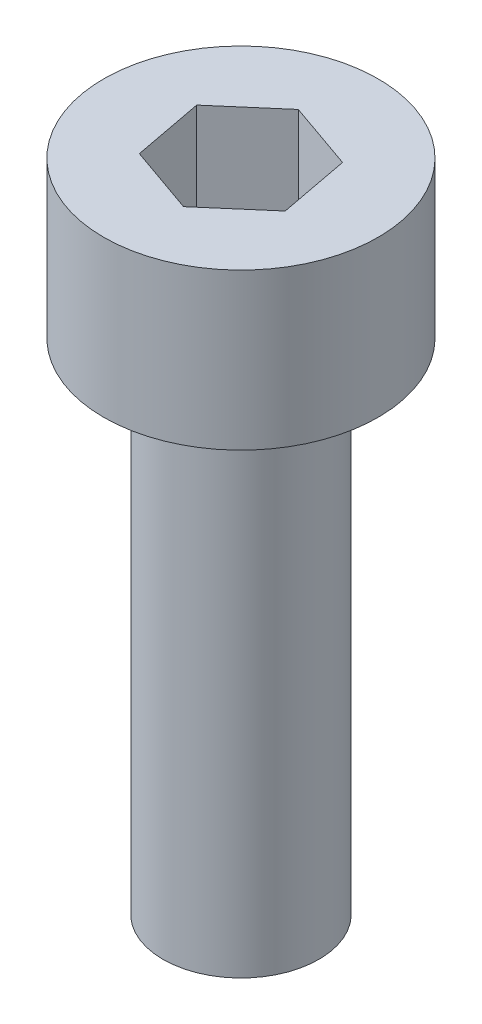
ISO-10303-21;
HEADER;
FILE_DESCRIPTION(('STEP AP214'),'2;1');
FILE_NAME('part.step','',(''),(''),'','','');
FILE_SCHEMA(('AUTOMOTIVE_DESIGN { 1 0 10303 214 1 1 1 1 }'));
ENDSEC;
DATA;
#1=APPLICATION_CONTEXT('core data for automotive mechanical design processes');
#2=APPLICATION_PROTOCOL_DEFINITION('international standard','automotive_design',2000,#1);
#3=PRODUCT_CONTEXT('',#1,'mechanical');
#4=PRODUCT('Part','Part','',(#3));
#5=PRODUCT_RELATED_PRODUCT_CATEGORY('part','',(#4));
#6=PRODUCT_DEFINITION_FORMATION('','',#4);
#7=PRODUCT_DEFINITION_CONTEXT('part definition',#1,'design');
#8=PRODUCT_DEFINITION('design','',#6,#7);
#9=PRODUCT_DEFINITION_SHAPE('','',#8);
#10=(LENGTH_UNIT() NAMED_UNIT(*) SI_UNIT(.MILLI.,.METRE.));
#11=(NAMED_UNIT(*) PLANE_ANGLE_UNIT() SI_UNIT($,.RADIAN.));
#12=(NAMED_UNIT(*) SI_UNIT($,.STERADIAN.) SOLID_ANGLE_UNIT());
#13=UNCERTAINTY_MEASURE_WITH_UNIT(LENGTH_MEASURE(1.E-05),#10,'distance_accuracy_value','');
#14=(GEOMETRIC_REPRESENTATION_CONTEXT(3) GLOBAL_UNCERTAINTY_ASSIGNED_CONTEXT((#13)) GLOBAL_UNIT_ASSIGNED_CONTEXT((#10,
#11,#12)) REPRESENTATION_CONTEXT('',''));
#15=CARTESIAN_POINT('',(0.,0.,0.));
#16=DIRECTION('',(0.,0.,1.));
#17=DIRECTION('',(1.,0.,0.));
#18=AXIS2_PLACEMENT_3D('',#15,#16,#17);
#19=CARTESIAN_POINT('',(0.,0.,0.));
#20=DIRECTION('',(0.,-1.,0.));
#21=DIRECTION('',(0.,0.,-1.));
#22=AXIS2_PLACEMENT_3D('',#19,#20,#21);
#23=PLANE('',#22);
#24=CARTESIAN_POINT('',(0.,0.,0.));
#25=DIRECTION('',(0.,1.,0.));
#26=DIRECTION('',(0.,0.,1.));
#27=AXIS2_PLACEMENT_3D('',#24,#25,#26);
#28=CIRCLE('',#27,1.25);
#29=CARTESIAN_POINT('',(0.,0.,1.25));
#30=VERTEX_POINT('',#29);
#31=EDGE_CURVE('E11',#30,#30,#28,.T.);
#32=ORIENTED_EDGE('',*,*,#31,.F.);
#33=EDGE_LOOP('',(#32));
#34=FACE_BOUND('',#33,.T.);
#35=ADVANCED_FACE('F37',(#34),#23,.T.);
#36=CARTESIAN_POINT('',(0.,8.82222536057694,0.));
#37=DIRECTION('',(0.,1.,0.));
#38=DIRECTION('',(0.,0.,1.));
#39=AXIS2_PLACEMENT_3D('',#36,#37,#38);
#40=CYLINDRICAL_SURFACE('',#39,1.25);
#41=ORIENTED_EDGE('',*,*,#31,.T.);
#42=EDGE_LOOP('',(#41));
#43=FACE_BOUND('',#42,.T.);
#44=CARTESIAN_POINT('',(0.,8.,0.));
#45=DIRECTION('',(0.,1.,0.));
#46=DIRECTION('',(0.,0.,1.));
#47=AXIS2_PLACEMENT_3D('',#44,#45,#46);
#48=CIRCLE('',#47,1.25);
#49=CARTESIAN_POINT('',(0.,8.,1.25));
#50=VERTEX_POINT('',#49);
#51=EDGE_CURVE('E44',#50,#50,#48,.T.);
#52=ORIENTED_EDGE('',*,*,#51,.F.);
#53=EDGE_LOOP('',(#52));
#54=FACE_BOUND('',#53,.T.);
#55=ADVANCED_FACE('F154',(#43,#54),#40,.T.);
#56=CARTESIAN_POINT('',(-1.25,8.,0.));
#57=DIRECTION('',(0.,-1.,0.));
#58=DIRECTION('',(0.,0.,-1.));
#59=AXIS2_PLACEMENT_3D('',#56,#57,#58);
#60=PLANE('',#59);
#61=ORIENTED_EDGE('',*,*,#51,.T.);
#62=EDGE_LOOP('',(#61));
#63=FACE_BOUND('',#62,.T.);
#64=CARTESIAN_POINT('',(0.,8.,0.));
#65=DIRECTION('',(0.,1.,0.));
#66=DIRECTION('',(0.,0.,1.));
#67=AXIS2_PLACEMENT_3D('',#64,#65,#66);
#68=CIRCLE('',#67,2.2);
#69=CARTESIAN_POINT('',(0.,8.,2.2));
#70=VERTEX_POINT('',#69);
#71=EDGE_CURVE('E146',#70,#70,#68,.T.);
#72=ORIENTED_EDGE('',*,*,#71,.F.);
#73=EDGE_LOOP('',(#72));
#74=FACE_BOUND('',#73,.T.);
#75=ADVANCED_FACE('F151',(#63,#74),#60,.T.);
#76=CARTESIAN_POINT('',(0.,8.82222536057694,0.));
#77=DIRECTION('',(0.,1.,0.));
#78=DIRECTION('',(0.,0.,1.));
#79=AXIS2_PLACEMENT_3D('',#76,#77,#78);
#80=CYLINDRICAL_SURFACE('',#79,2.2);
#81=ORIENTED_EDGE('',*,*,#71,.T.);
#82=EDGE_LOOP('',(#81));
#83=FACE_BOUND('',#82,.T.);
#84=CARTESIAN_POINT('',(0.,10.5,0.));
#85=DIRECTION('',(0.,1.,0.));
#86=DIRECTION('',(0.,0.,1.));
#87=AXIS2_PLACEMENT_3D('',#84,#85,#86);
#88=CIRCLE('',#87,2.2);
#89=CARTESIAN_POINT('',(0.,10.5,2.2));
#90=VERTEX_POINT('',#89);
#91=EDGE_CURVE('E138',#90,#90,#88,.T.);
#92=ORIENTED_EDGE('',*,*,#91,.F.);
#93=EDGE_LOOP('',(#92));
#94=FACE_BOUND('',#93,.T.);
#95=ADVANCED_FACE('F161',(#83,#94),#80,.T.);
#96=CARTESIAN_POINT('',(-2.2,10.5,0.));
#97=DIRECTION('',(0.,1.,0.));
#98=DIRECTION('',(0.,0.,1.));
#99=AXIS2_PLACEMENT_3D('',#96,#97,#98);
#100=PLANE('',#99);
#101=DIRECTION('',(-0.186175824705709,0.,-0.982516443778499));
#102=VECTOR('',#101,1.);
#103=CARTESIAN_POINT('',(1.09000510628894,10.5,0.381080308593042));
#104=LINE('',#103,#102);
#105=CARTESIAN_POINT('',(1.09000510628894,10.5,0.381080308593042));
#106=VERTEX_POINT('',#105);
#107=CARTESIAN_POINT('',(0.875027781268058,10.5,-0.753431958004459));
#108=VERTEX_POINT('',#107);
#109=EDGE_CURVE('E51',#106,#108,#104,.T.);
#110=ORIENTED_EDGE('',*,*,#109,.F.);
#111=DIRECTION('',(0.757796287595271,0.,-0.652491215654912));
#112=VECTOR('',#111,1.);
#113=CARTESIAN_POINT('',(0.214977325020883,10.5,1.1345122665975));
#114=LINE('',#113,#112);
#115=CARTESIAN_POINT('',(0.214977325020883,10.5,1.1345122665975));
#116=VERTEX_POINT('',#115);
#117=EDGE_CURVE('E134',#116,#106,#114,.T.);
#118=ORIENTED_EDGE('',*,*,#117,.F.);
#119=DIRECTION('',(0.94397211230098,0.,0.330025228123587));
#120=VECTOR('',#119,1.);
#121=CARTESIAN_POINT('',(-0.875027781268057,10.5,0.75343195800446));
#122=LINE('',#121,#120);
#123=CARTESIAN_POINT('',(-0.875027781268057,10.5,0.75343195800446));
#124=VERTEX_POINT('',#123);
#125=EDGE_CURVE('E132',#124,#116,#122,.T.);
#126=ORIENTED_EDGE('',*,*,#125,.F.);
#127=DIRECTION('',(0.186175824705709,0.,0.982516443778499));
#128=VECTOR('',#127,1.);
#129=CARTESIAN_POINT('',(-1.09000510628894,10.5,-0.381080308593041));
#130=LINE('',#129,#128);
#131=CARTESIAN_POINT('',(-1.09000510628894,10.5,-0.381080308593041));
#132=VERTEX_POINT('',#131);
#133=EDGE_CURVE('E99',#132,#124,#130,.T.);
#134=ORIENTED_EDGE('',*,*,#133,.F.);
#135=DIRECTION('',(-0.757796287595271,0.,0.652491215654912));
#136=VECTOR('',#135,1.);
#137=CARTESIAN_POINT('',(-0.214977325020883,10.5,-1.1345122665975));
#138=LINE('',#137,#136);
#139=CARTESIAN_POINT('',(-0.214977325020883,10.5,-1.1345122665975));
#140=VERTEX_POINT('',#139);
#141=EDGE_CURVE('E128',#140,#132,#138,.T.);
#142=ORIENTED_EDGE('',*,*,#141,.F.);
#143=DIRECTION('',(-0.94397211230098,0.,-0.330025228123587));
#144=VECTOR('',#143,1.);
#145=CARTESIAN_POINT('',(0.875027781268058,10.5,-0.753431958004459));
#146=LINE('',#145,#144);
#147=EDGE_CURVE('E125',#108,#140,#146,.T.);
#148=ORIENTED_EDGE('',*,*,#147,.F.);
#149=EDGE_LOOP('',(#110,#118,#126,#134,#142,#148));
#150=FACE_BOUND('',#149,.T.);
#151=ORIENTED_EDGE('',*,*,#91,.T.);
#152=EDGE_LOOP('',(#151));
#153=FACE_BOUND('',#152,.T.);
#154=ADVANCED_FACE('F167',(#150,#153),#100,.T.);
#155=CARTESIAN_POINT('',(1.09000510628894,8.5,0.381080308593042));
#156=DIRECTION('',(0.982516443778499,0.,-0.186175824705709));
#157=DIRECTION('',(-0.186175824705709,0.,-0.9825164437785));
#158=AXIS2_PLACEMENT_3D('',#155,#156,#157);
#159=PLANE('',#158);
#160=ORIENTED_EDGE('',*,*,#109,.T.);
#161=DIRECTION('',(0.,1.,0.));
#162=VECTOR('',#161,1.);
#163=CARTESIAN_POINT('',(0.875027781268058,8.5,-0.753431958004459));
#164=LINE('',#163,#162);
#165=CARTESIAN_POINT('',(0.875027781268058,8.5,-0.753431958004459));
#166=VERTEX_POINT('',#165);
#167=EDGE_CURVE('E81',#166,#108,#164,.T.);
#168=ORIENTED_EDGE('',*,*,#167,.F.);
#169=DIRECTION('',(-0.186175824705709,0.,-0.982516443778499));
#170=VECTOR('',#169,1.);
#171=CARTESIAN_POINT('',(1.09000510628894,8.5,0.381080308593042));
#172=LINE('',#171,#170);
#173=CARTESIAN_POINT('',(1.09000510628894,8.5,0.381080308593042));
#174=VERTEX_POINT('',#173);
#175=EDGE_CURVE('E136',#174,#166,#172,.T.);
#176=ORIENTED_EDGE('',*,*,#175,.F.);
#177=DIRECTION('',(0.,1.,0.));
#178=VECTOR('',#177,1.);
#179=CARTESIAN_POINT('',(1.09000510628894,8.5,0.381080308593042));
#180=LINE('',#179,#178);
#181=EDGE_CURVE('E59',#174,#106,#180,.T.);
#182=ORIENTED_EDGE('',*,*,#181,.T.);
#183=EDGE_LOOP('',(#160,#168,#176,#182));
#184=FACE_BOUND('',#183,.T.);
#185=ADVANCED_FACE('F171',(#184),#159,.F.);
#186=CARTESIAN_POINT('',(0.214977325020883,8.5,1.1345122665975));
#187=DIRECTION('',(0.652491215654912,0.,0.757796287595271));
#188=DIRECTION('',(0.757796287595271,0.,-0.652491215654912));
#189=AXIS2_PLACEMENT_3D('',#186,#187,#188);
#190=PLANE('',#189);
#191=ORIENTED_EDGE('',*,*,#117,.T.);
#192=ORIENTED_EDGE('',*,*,#181,.F.);
#193=DIRECTION('',(0.757796287595271,0.,-0.652491215654912));
#194=VECTOR('',#193,1.);
#195=CARTESIAN_POINT('',(0.214977325020883,8.5,1.1345122665975));
#196=LINE('',#195,#194);
#197=CARTESIAN_POINT('',(0.214977325020883,8.5,1.1345122665975));
#198=VERTEX_POINT('',#197);
#199=EDGE_CURVE('E111',#198,#174,#196,.T.);
#200=ORIENTED_EDGE('',*,*,#199,.F.);
#201=DIRECTION('',(0.,1.,0.));
#202=VECTOR('',#201,1.);
#203=CARTESIAN_POINT('',(0.214977325020883,8.5,1.1345122665975));
#204=LINE('',#203,#202);
#205=EDGE_CURVE('E103',#198,#116,#204,.T.);
#206=ORIENTED_EDGE('',*,*,#205,.T.);
#207=EDGE_LOOP('',(#191,#192,#200,#206));
#208=FACE_BOUND('',#207,.T.);
#209=ADVANCED_FACE('F175',(#208),#190,.F.);
#210=CARTESIAN_POINT('',(-0.875027781268057,8.5,0.75343195800446));
#211=DIRECTION('',(-0.330025228123587,0.,0.94397211230098));
#212=DIRECTION('',(0.94397211230098,0.,0.330025228123587));
#213=AXIS2_PLACEMENT_3D('',#210,#211,#212);
#214=PLANE('',#213);
#215=ORIENTED_EDGE('',*,*,#125,.T.);
#216=ORIENTED_EDGE('',*,*,#205,.F.);
#217=DIRECTION('',(0.94397211230098,0.,0.330025228123587));
#218=VECTOR('',#217,1.);
#219=CARTESIAN_POINT('',(-0.875027781268057,8.5,0.75343195800446));
#220=LINE('',#219,#218);
#221=CARTESIAN_POINT('',(-0.875027781268057,8.5,0.75343195800446));
#222=VERTEX_POINT('',#221);
#223=EDGE_CURVE('E107',#222,#198,#220,.T.);
#224=ORIENTED_EDGE('',*,*,#223,.F.);
#225=DIRECTION('',(0.,1.,0.));
#226=VECTOR('',#225,1.);
#227=CARTESIAN_POINT('',(-0.875027781268057,8.5,0.75343195800446));
#228=LINE('',#227,#226);
#229=EDGE_CURVE('E92',#222,#124,#228,.T.);
#230=ORIENTED_EDGE('',*,*,#229,.T.);
#231=EDGE_LOOP('',(#215,#216,#224,#230));
#232=FACE_BOUND('',#231,.T.);
#233=ADVANCED_FACE('F108',(#232),#214,.F.);
#234=CARTESIAN_POINT('',(-1.09000510628894,8.5,-0.381080308593041));
#235=DIRECTION('',(-0.982516443778499,0.,0.186175824705709));
#236=DIRECTION('',(0.186175824705709,0.,0.982516443778499));
#237=AXIS2_PLACEMENT_3D('',#234,#235,#236);
#238=PLANE('',#237);
#239=ORIENTED_EDGE('',*,*,#133,.T.);
#240=ORIENTED_EDGE('',*,*,#229,.F.);
#241=DIRECTION('',(0.186175824705709,0.,0.982516443778499));
#242=VECTOR('',#241,1.);
#243=CARTESIAN_POINT('',(-1.09000510628894,8.5,-0.381080308593041));
#244=LINE('',#243,#242);
#245=CARTESIAN_POINT('',(-1.09000510628894,8.5,-0.381080308593041));
#246=VERTEX_POINT('',#245);
#247=EDGE_CURVE('E96',#246,#222,#244,.T.);
#248=ORIENTED_EDGE('',*,*,#247,.F.);
#249=DIRECTION('',(0.,1.,0.));
#250=VECTOR('',#249,1.);
#251=CARTESIAN_POINT('',(-1.09000510628894,8.5,-0.381080308593041));
#252=LINE('',#251,#250);
#253=EDGE_CURVE('E104',#246,#132,#252,.T.);
#254=ORIENTED_EDGE('',*,*,#253,.T.);
#255=EDGE_LOOP('',(#239,#240,#248,#254));
#256=FACE_BOUND('',#255,.T.);
#257=ADVANCED_FACE('F94',(#256),#238,.F.);
#258=CARTESIAN_POINT('',(-0.214977325020883,8.5,-1.1345122665975));
#259=DIRECTION('',(-0.652491215654912,0.,-0.757796287595271));
#260=DIRECTION('',(-0.757796287595271,0.,0.652491215654912));
#261=AXIS2_PLACEMENT_3D('',#258,#259,#260);
#262=PLANE('',#261);
#263=ORIENTED_EDGE('',*,*,#141,.T.);
#264=ORIENTED_EDGE('',*,*,#253,.F.);
#265=DIRECTION('',(-0.757796287595271,0.,0.652491215654912));
#266=VECTOR('',#265,1.);
#267=CARTESIAN_POINT('',(-0.214977325020883,8.5,-1.1345122665975));
#268=LINE('',#267,#266);
#269=CARTESIAN_POINT('',(-0.214977325020883,8.5,-1.1345122665975));
#270=VERTEX_POINT('',#269);
#271=EDGE_CURVE('E117',#270,#246,#268,.T.);
#272=ORIENTED_EDGE('',*,*,#271,.F.);
#273=DIRECTION('',(0.,1.,0.));
#274=VECTOR('',#273,1.);
#275=CARTESIAN_POINT('',(-0.214977325020883,8.5,-1.1345122665975));
#276=LINE('',#275,#274);
#277=EDGE_CURVE('E141',#270,#140,#276,.T.);
#278=ORIENTED_EDGE('',*,*,#277,.T.);
#279=EDGE_LOOP('',(#263,#264,#272,#278));
#280=FACE_BOUND('',#279,.T.);
#281=ADVANCED_FACE('F179',(#280),#262,.F.);
#282=CARTESIAN_POINT('',(0.875027781268058,8.5,-0.753431958004459));
#283=DIRECTION('',(0.330025228123587,0.,-0.94397211230098));
#284=DIRECTION('',(-0.94397211230098,0.,-0.330025228123587));
#285=AXIS2_PLACEMENT_3D('',#282,#283,#284);
#286=PLANE('',#285);
#287=ORIENTED_EDGE('',*,*,#147,.T.);
#288=ORIENTED_EDGE('',*,*,#277,.F.);
#289=DIRECTION('',(-0.94397211230098,0.,-0.330025228123587));
#290=VECTOR('',#289,1.);
#291=CARTESIAN_POINT('',(0.875027781268058,8.5,-0.753431958004459));
#292=LINE('',#291,#290);
#293=EDGE_CURVE('E119',#166,#270,#292,.T.);
#294=ORIENTED_EDGE('',*,*,#293,.F.);
#295=ORIENTED_EDGE('',*,*,#167,.T.);
#296=EDGE_LOOP('',(#287,#288,#294,#295));
#297=FACE_BOUND('',#296,.T.);
#298=ADVANCED_FACE('F176',(#297),#286,.F.);
#299=CARTESIAN_POINT('',(0.,8.5,0.));
#300=DIRECTION('',(0.,1.,0.));
#301=DIRECTION('',(0.,0.,1.));
#302=AXIS2_PLACEMENT_3D('',#299,#300,#301);
#303=PLANE('',#302);
#304=ORIENTED_EDGE('',*,*,#175,.T.);
#305=ORIENTED_EDGE('',*,*,#293,.T.);
#306=ORIENTED_EDGE('',*,*,#271,.T.);
#307=ORIENTED_EDGE('',*,*,#247,.T.);
#308=ORIENTED_EDGE('',*,*,#223,.T.);
#309=ORIENTED_EDGE('',*,*,#199,.T.);
#310=EDGE_LOOP('',(#304,#305,#306,#307,#308,#309));
#311=FACE_BOUND('',#310,.T.);
#312=ADVANCED_FACE('F114',(#311),#303,.T.);
#313=CLOSED_SHELL('',(#35,#55,#75,#95,#154,#185,#209,#233,#257,#281,#298,#312));
#314=MANIFOLD_SOLID_BREP('B2',#313);
#315=ADVANCED_BREP_SHAPE_REPRESENTATION('',(#18,#314),#14);
#316=SHAPE_DEFINITION_REPRESENTATION(#9,#315);
ENDSEC;
END-ISO-10303-21;
